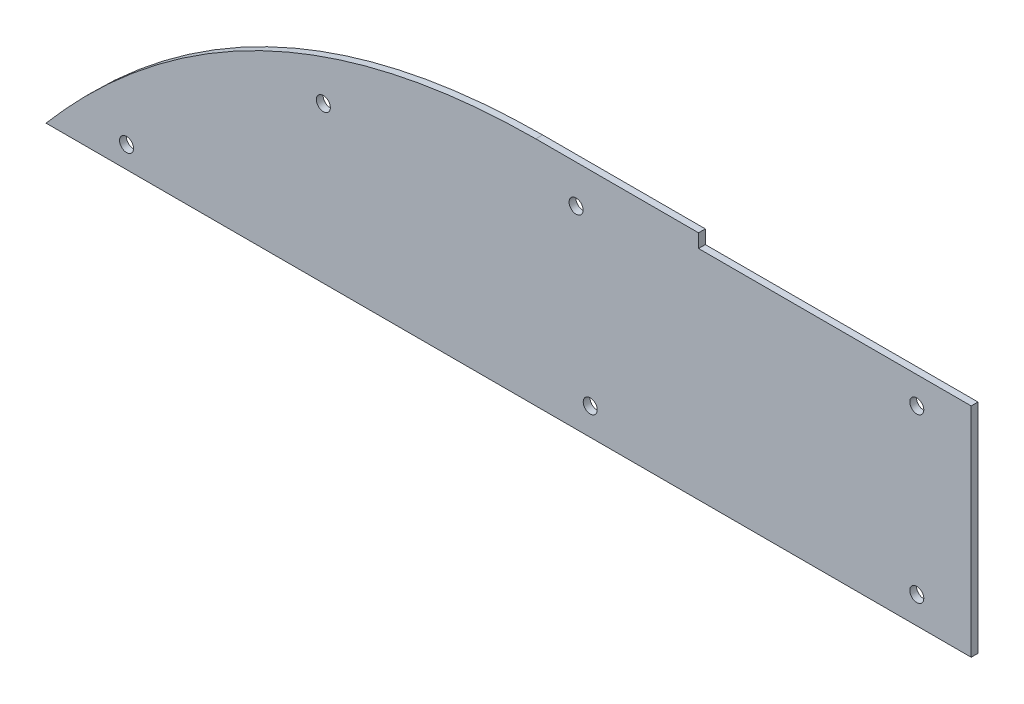
ISO-10303-21;
HEADER;
FILE_DESCRIPTION(('STEP AP214'),'2;1');
FILE_NAME('part.step','',(''),(''),'','','');
FILE_SCHEMA(('AUTOMOTIVE_DESIGN { 1 0 10303 214 1 1 1 1 }'));
ENDSEC;
DATA;
#1=APPLICATION_CONTEXT('core data for automotive mechanical design processes');
#2=APPLICATION_PROTOCOL_DEFINITION('international standard','automotive_design',2000,#1);
#3=PRODUCT_CONTEXT('',#1,'mechanical');
#4=PRODUCT('Part','Part','',(#3));
#5=PRODUCT_RELATED_PRODUCT_CATEGORY('part','',(#4));
#6=PRODUCT_DEFINITION_FORMATION('','',#4);
#7=PRODUCT_DEFINITION_CONTEXT('part definition',#1,'design');
#8=PRODUCT_DEFINITION('design','',#6,#7);
#9=PRODUCT_DEFINITION_SHAPE('','',#8);
#10=(LENGTH_UNIT() NAMED_UNIT(*) SI_UNIT(.MILLI.,.METRE.));
#11=(NAMED_UNIT(*) PLANE_ANGLE_UNIT() SI_UNIT($,.RADIAN.));
#12=(NAMED_UNIT(*) SI_UNIT($,.STERADIAN.) SOLID_ANGLE_UNIT());
#13=UNCERTAINTY_MEASURE_WITH_UNIT(LENGTH_MEASURE(1.E-05),#10,'distance_accuracy_value','');
#14=(GEOMETRIC_REPRESENTATION_CONTEXT(3) GLOBAL_UNCERTAINTY_ASSIGNED_CONTEXT((#13)) GLOBAL_UNIT_ASSIGNED_CONTEXT((#10,
#11,#12)) REPRESENTATION_CONTEXT('',''));
#15=CARTESIAN_POINT('',(0.,0.,0.));
#16=DIRECTION('',(0.,0.,1.));
#17=DIRECTION('',(1.,0.,0.));
#18=AXIS2_PLACEMENT_3D('',#15,#16,#17);
#19=CARTESIAN_POINT('',(127.,0.,0.));
#20=DIRECTION('',(1.,0.,0.));
#21=DIRECTION('',(0.,0.,-1.));
#22=AXIS2_PLACEMENT_3D('',#19,#20,#21);
#23=PLANE('',#22);
#24=DIRECTION('',(0.,1.,0.));
#25=VECTOR('',#24,1.);
#26=CARTESIAN_POINT('',(127.,76.2,3.175));
#27=LINE('',#26,#25);
#28=CARTESIAN_POINT('',(127.,0.,3.175));
#29=VERTEX_POINT('',#28);
#30=CARTESIAN_POINT('',(127.,101.6,3.175));
#31=VERTEX_POINT('',#30);
#32=EDGE_CURVE('E110',#29,#31,#27,.T.);
#33=ORIENTED_EDGE('',*,*,#32,.F.);
#34=DIRECTION('',(0.,0.,-1.));
#35=VECTOR('',#34,1.);
#36=CARTESIAN_POINT('',(127.,0.,3.175));
#37=LINE('',#36,#35);
#38=CARTESIAN_POINT('',(127.,0.,0.));
#39=VERTEX_POINT('',#38);
#40=EDGE_CURVE('E116',#29,#39,#37,.T.);
#41=ORIENTED_EDGE('',*,*,#40,.T.);
#42=DIRECTION('',(0.,-1.,0.));
#43=VECTOR('',#42,1.);
#44=CARTESIAN_POINT('',(127.,80.6674906682584,0.));
#45=LINE('',#44,#43);
#46=CARTESIAN_POINT('',(127.,101.6,0.));
#47=VERTEX_POINT('',#46);
#48=EDGE_CURVE('E49',#47,#39,#45,.T.);
#49=ORIENTED_EDGE('',*,*,#48,.F.);
#50=DIRECTION('',(0.,0.,1.));
#51=VECTOR('',#50,1.);
#52=CARTESIAN_POINT('',(127.,101.6,0.));
#53=LINE('',#52,#51);
#54=EDGE_CURVE('E102',#47,#31,#53,.T.);
#55=ORIENTED_EDGE('',*,*,#54,.T.);
#56=EDGE_LOOP('',(#33,#41,#49,#55));
#57=FACE_BOUND('',#56,.T.);
#58=ADVANCED_FACE('F45',(#57),#23,.T.);
#59=CARTESIAN_POINT('',(-1.929,76.2,3.175));
#60=DIRECTION('',(0.,0.,1.));
#61=DIRECTION('',(1.,0.,0.));
#62=AXIS2_PLACEMENT_3D('',#59,#60,#61);
#63=PLANE('',#62);
#64=CARTESIAN_POINT('',(101.6,88.9,3.175));
#65=DIRECTION('',(0.,0.,-1.));
#66=DIRECTION('',(-1.,0.,0.));
#67=AXIS2_PLACEMENT_3D('',#64,#65,#66);
#68=CIRCLE('',#67,3.27500000000001);
#69=CARTESIAN_POINT('',(98.325,88.9,3.175));
#70=VERTEX_POINT('',#69);
#71=EDGE_CURVE('E159',#70,#70,#68,.T.);
#72=ORIENTED_EDGE('',*,*,#71,.T.);
#73=EDGE_LOOP('',(#72));
#74=FACE_BOUND('',#73,.T.);
#75=CARTESIAN_POINT('',(101.6,12.7,3.175));
#76=DIRECTION('',(0.,0.,-1.));
#77=DIRECTION('',(-1.,0.,0.));
#78=AXIS2_PLACEMENT_3D('',#75,#76,#77);
#79=CIRCLE('',#78,3.27500000000001);
#80=CARTESIAN_POINT('',(98.325,12.7,3.175));
#81=VERTEX_POINT('',#80);
#82=EDGE_CURVE('E156',#81,#81,#79,.T.);
#83=ORIENTED_EDGE('',*,*,#82,.T.);
#84=EDGE_LOOP('',(#83));
#85=FACE_BOUND('',#84,.T.);
#86=CARTESIAN_POINT('',(-50.8,12.7,3.175));
#87=DIRECTION('',(0.,0.,-1.));
#88=DIRECTION('',(-1.,0.,0.));
#89=AXIS2_PLACEMENT_3D('',#86,#87,#88);
#90=CIRCLE('',#89,3.27500000000001);
#91=CARTESIAN_POINT('',(-54.075,12.7,3.175));
#92=VERTEX_POINT('',#91);
#93=EDGE_CURVE('E149',#92,#92,#90,.T.);
#94=ORIENTED_EDGE('',*,*,#93,.T.);
#95=EDGE_LOOP('',(#94));
#96=FACE_BOUND('',#95,.T.);
#97=CARTESIAN_POINT('',(-175.365808452393,72.6222695788124,3.175));
#98=DIRECTION('',(0.,0.,1.));
#99=DIRECTION('',(1.,0.,0.));
#100=AXIS2_PLACEMENT_3D('',#97,#98,#99);
#101=CIRCLE('',#100,3.27499999999999);
#102=CARTESIAN_POINT('',(-172.090808452393,72.6222695788124,3.175));
#103=VERTEX_POINT('',#102);
#104=EDGE_CURVE('E177',#103,#103,#101,.F.);
#105=ORIENTED_EDGE('',*,*,#104,.T.);
#106=EDGE_LOOP('',(#105));
#107=FACE_BOUND('',#106,.T.);
#108=CARTESIAN_POINT('',(-267.208000000189,10.1599999999449,3.175));
#109=DIRECTION('',(0.,0.,1.));
#110=DIRECTION('',(1.,0.,0.));
#111=AXIS2_PLACEMENT_3D('',#108,#109,#110);
#112=CIRCLE('',#111,3.27499999999996);
#113=CARTESIAN_POINT('',(-263.933000000189,10.1599999999449,3.175));
#114=VERTEX_POINT('',#113);
#115=EDGE_CURVE('E54',#114,#114,#112,.F.);
#116=ORIENTED_EDGE('',*,*,#115,.T.);
#117=EDGE_LOOP('',(#116));
#118=FACE_BOUND('',#117,.T.);
#119=CARTESIAN_POINT('',(-57.404,90.1701915203067,3.175));
#120=DIRECTION('',(0.,0.,1.));
#121=DIRECTION('',(1.,0.,0.));
#122=AXIS2_PLACEMENT_3D('',#119,#120,#121);
#123=CIRCLE('',#122,3.27500000000001);
#124=CARTESIAN_POINT('',(-54.129,90.1701915203067,3.175));
#125=VERTEX_POINT('',#124);
#126=EDGE_CURVE('E174',#125,#125,#123,.F.);
#127=ORIENTED_EDGE('',*,*,#126,.T.);
#128=EDGE_LOOP('',(#127));
#129=FACE_BOUND('',#128,.T.);
#130=DIRECTION('',(1.,0.,0.));
#131=VECTOR('',#130,1.);
#132=CARTESIAN_POINT('',(0.,0.,3.175));
#133=LINE('',#132,#131);
#134=CARTESIAN_POINT('',(-304.8,0.,3.175));
#135=VERTEX_POINT('',#134);
#136=EDGE_CURVE('E112',#135,#29,#133,.T.);
#137=ORIENTED_EDGE('',*,*,#136,.T.);
#138=ORIENTED_EDGE('',*,*,#32,.T.);
#139=DIRECTION('',(1.,0.,0.));
#140=VECTOR('',#139,1.);
#141=CARTESIAN_POINT('',(609.6,101.6,3.175));
#142=LINE('',#141,#140);
#143=CARTESIAN_POINT('',(-0.254,101.6,3.175));
#144=VERTEX_POINT('',#143);
#145=EDGE_CURVE('E62',#144,#31,#142,.T.);
#146=ORIENTED_EDGE('',*,*,#145,.F.);
#147=DIRECTION('',(0.,1.,0.));
#148=VECTOR('',#147,1.);
#149=CARTESIAN_POINT('',(-0.254,107.95,3.175));
#150=LINE('',#149,#148);
#151=CARTESIAN_POINT('',(-0.254,107.95,3.175));
#152=VERTEX_POINT('',#151);
#153=EDGE_CURVE('E172',#144,#152,#150,.T.);
#154=ORIENTED_EDGE('',*,*,#153,.T.);
#155=DIRECTION('',(-1.,0.,0.));
#156=VECTOR('',#155,1.);
#157=CARTESIAN_POINT('',(0.,107.95,3.175));
#158=LINE('',#157,#156);
#159=CARTESIAN_POINT('',(-76.2,107.95,3.175));
#160=VERTEX_POINT('',#159);
#161=EDGE_CURVE('E133',#152,#160,#158,.T.);
#162=ORIENTED_EDGE('',*,*,#161,.T.);
#163=CARTESIAN_POINT('',(-76.2,107.95,3.175));
#164=CARTESIAN_POINT('',(-213.403997346706,107.359981336517,3.175));
#165=CARTESIAN_POINT('',(-304.8,0.,3.175));
#166=B_SPLINE_CURVE_WITH_KNOTS('',2,(#163,#164,#165),.UNSPECIFIED.,.F.,.F.,(3,3),(0.,1.),.UNSPECIFIED.);
#167=EDGE_CURVE('E11',#160,#135,#166,.T.);
#168=ORIENTED_EDGE('',*,*,#167,.T.);
#169=EDGE_LOOP('',(#137,#138,#146,#154,#162,#168));
#170=FACE_BOUND('',#169,.T.);
#171=ADVANCED_FACE('F111',(#74,#85,#96,#107,#118,#129,#170),#63,.T.);
#172=CARTESIAN_POINT('',(0.,0.,3.175));
#173=DIRECTION('',(0.,1.,0.));
#174=DIRECTION('',(-1.,0.,0.));
#175=AXIS2_PLACEMENT_3D('',#172,#173,#174);
#176=PLANE('',#175);
#177=ORIENTED_EDGE('',*,*,#40,.F.);
#178=ORIENTED_EDGE('',*,*,#136,.F.);
#179=DIRECTION('',(0.,0.,-1.));
#180=VECTOR('',#179,1.);
#181=CARTESIAN_POINT('',(-304.8,0.,3.175));
#182=LINE('',#181,#180);
#183=CARTESIAN_POINT('',(-304.8,0.,0.));
#184=VERTEX_POINT('',#183);
#185=EDGE_CURVE('E129',#135,#184,#182,.T.);
#186=ORIENTED_EDGE('',*,*,#185,.T.);
#187=DIRECTION('',(1.,0.,0.));
#188=VECTOR('',#187,1.);
#189=CARTESIAN_POINT('',(0.,0.,0.));
#190=LINE('',#189,#188);
#191=EDGE_CURVE('E124',#184,#39,#190,.T.);
#192=ORIENTED_EDGE('',*,*,#191,.T.);
#193=EDGE_LOOP('',(#177,#178,#186,#192));
#194=FACE_BOUND('',#193,.T.);
#195=ADVANCED_FACE('F204',(#194),#176,.F.);
#196=CARTESIAN_POINT('',(811.551998673353,80.6674906682584,0.));
#197=DIRECTION('',(0.,0.,-1.));
#198=DIRECTION('',(-1.,0.,0.));
#199=AXIS2_PLACEMENT_3D('',#196,#197,#198);
#200=PLANE('',#199);
#201=CARTESIAN_POINT('',(-57.404,90.1701915203067,0.));
#202=DIRECTION('',(0.,0.,1.));
#203=DIRECTION('',(1.,0.,0.));
#204=AXIS2_PLACEMENT_3D('',#201,#202,#203);
#205=CIRCLE('',#204,3.27500000000001);
#206=CARTESIAN_POINT('',(-54.129,90.1701915203067,0.));
#207=VERTEX_POINT('',#206);
#208=EDGE_CURVE('E145',#207,#207,#205,.T.);
#209=ORIENTED_EDGE('',*,*,#208,.T.);
#210=EDGE_LOOP('',(#209));
#211=FACE_BOUND('',#210,.T.);
#212=CARTESIAN_POINT('',(-175.365808452393,72.6222695788124,0.));
#213=DIRECTION('',(0.,0.,1.));
#214=DIRECTION('',(1.,0.,0.));
#215=AXIS2_PLACEMENT_3D('',#212,#213,#214);
#216=CIRCLE('',#215,3.27499999999999);
#217=CARTESIAN_POINT('',(-172.090808452393,72.6222695788124,0.));
#218=VERTEX_POINT('',#217);
#219=EDGE_CURVE('E148',#218,#218,#216,.T.);
#220=ORIENTED_EDGE('',*,*,#219,.T.);
#221=EDGE_LOOP('',(#220));
#222=FACE_BOUND('',#221,.T.);
#223=CARTESIAN_POINT('',(-267.208000000189,10.1599999999449,0.));
#224=DIRECTION('',(0.,0.,1.));
#225=DIRECTION('',(1.,0.,0.));
#226=AXIS2_PLACEMENT_3D('',#223,#224,#225);
#227=CIRCLE('',#226,3.27499999999996);
#228=CARTESIAN_POINT('',(-263.933000000189,10.1599999999449,0.));
#229=VERTEX_POINT('',#228);
#230=EDGE_CURVE('E107',#229,#229,#227,.T.);
#231=ORIENTED_EDGE('',*,*,#230,.T.);
#232=EDGE_LOOP('',(#231));
#233=FACE_BOUND('',#232,.T.);
#234=CARTESIAN_POINT('',(101.6,88.9,0.));
#235=DIRECTION('',(0.,0.,-1.));
#236=DIRECTION('',(-1.,0.,0.));
#237=AXIS2_PLACEMENT_3D('',#234,#235,#236);
#238=CIRCLE('',#237,3.27500000000001);
#239=CARTESIAN_POINT('',(98.325,88.9,0.));
#240=VERTEX_POINT('',#239);
#241=EDGE_CURVE('E163',#240,#240,#238,.T.);
#242=ORIENTED_EDGE('',*,*,#241,.F.);
#243=EDGE_LOOP('',(#242));
#244=FACE_BOUND('',#243,.T.);
#245=CARTESIAN_POINT('',(101.6,12.7,0.));
#246=DIRECTION('',(0.,0.,-1.));
#247=DIRECTION('',(-1.,0.,0.));
#248=AXIS2_PLACEMENT_3D('',#245,#246,#247);
#249=CIRCLE('',#248,3.27500000000001);
#250=CARTESIAN_POINT('',(98.325,12.7,0.));
#251=VERTEX_POINT('',#250);
#252=EDGE_CURVE('E166',#251,#251,#249,.T.);
#253=ORIENTED_EDGE('',*,*,#252,.F.);
#254=EDGE_LOOP('',(#253));
#255=FACE_BOUND('',#254,.T.);
#256=CARTESIAN_POINT('',(-50.8,12.7,0.));
#257=DIRECTION('',(0.,0.,-1.));
#258=DIRECTION('',(-1.,0.,0.));
#259=AXIS2_PLACEMENT_3D('',#256,#257,#258);
#260=CIRCLE('',#259,3.27500000000001);
#261=CARTESIAN_POINT('',(-54.075,12.7,0.));
#262=VERTEX_POINT('',#261);
#263=EDGE_CURVE('E162',#262,#262,#260,.T.);
#264=ORIENTED_EDGE('',*,*,#263,.F.);
#265=EDGE_LOOP('',(#264));
#266=FACE_BOUND('',#265,.T.);
#267=DIRECTION('',(1.,0.,0.));
#268=VECTOR('',#267,1.);
#269=CARTESIAN_POINT('',(-0.254,101.6,0.));
#270=LINE('',#269,#268);
#271=CARTESIAN_POINT('',(-0.253999999999976,101.6,0.));
#272=VERTEX_POINT('',#271);
#273=EDGE_CURVE('E121',#272,#47,#270,.T.);
#274=ORIENTED_EDGE('',*,*,#273,.T.);
#275=ORIENTED_EDGE('',*,*,#48,.T.);
#276=ORIENTED_EDGE('',*,*,#191,.F.);
#277=CARTESIAN_POINT('',(-76.2,107.95,0.));
#278=CARTESIAN_POINT('',(-213.403997346706,107.359981336517,0.));
#279=CARTESIAN_POINT('',(-304.8,0.,0.));
#280=B_SPLINE_CURVE_WITH_KNOTS('',2,(#277,#278,#279),.UNSPECIFIED.,.F.,.F.,(3,3),(0.,1.),.UNSPECIFIED.);
#281=CARTESIAN_POINT('',(-76.2,107.95,0.));
#282=VERTEX_POINT('',#281);
#283=EDGE_CURVE('E127',#282,#184,#280,.T.);
#284=ORIENTED_EDGE('',*,*,#283,.F.);
#285=DIRECTION('',(-1.,0.,0.));
#286=VECTOR('',#285,1.);
#287=CARTESIAN_POINT('',(0.,107.95,0.));
#288=LINE('',#287,#286);
#289=CARTESIAN_POINT('',(-0.254,107.95,0.));
#290=VERTEX_POINT('',#289);
#291=EDGE_CURVE('E130',#290,#282,#288,.T.);
#292=ORIENTED_EDGE('',*,*,#291,.F.);
#293=DIRECTION('',(0.,-1.,0.));
#294=VECTOR('',#293,1.);
#295=CARTESIAN_POINT('',(-0.254,107.95,0.));
#296=LINE('',#295,#294);
#297=EDGE_CURVE('E106',#290,#272,#296,.T.);
#298=ORIENTED_EDGE('',*,*,#297,.T.);
#299=EDGE_LOOP('',(#274,#275,#276,#284,#292,#298));
#300=FACE_BOUND('',#299,.T.);
#301=ADVANCED_FACE('F207',(#211,#222,#233,#244,#255,#266,#300),#200,.T.);
#302=CARTESIAN_POINT('',(609.6,101.6,0.));
#303=DIRECTION('',(0.,-1.,0.));
#304=DIRECTION('',(0.,0.,-1.));
#305=AXIS2_PLACEMENT_3D('',#302,#303,#304);
#306=PLANE('',#305);
#307=ORIENTED_EDGE('',*,*,#54,.F.);
#308=ORIENTED_EDGE('',*,*,#273,.F.);
#309=DIRECTION('',(0.,0.,1.));
#310=VECTOR('',#309,1.);
#311=CARTESIAN_POINT('',(-0.254,101.6,0.));
#312=LINE('',#311,#310);
#313=EDGE_CURVE('E104',#272,#144,#312,.T.);
#314=ORIENTED_EDGE('',*,*,#313,.T.);
#315=ORIENTED_EDGE('',*,*,#145,.T.);
#316=EDGE_LOOP('',(#307,#308,#314,#315));
#317=FACE_BOUND('',#316,.T.);
#318=ADVANCED_FACE('F47',(#317),#306,.F.);
#319=CARTESIAN_POINT('',(0.,107.95,3.175));
#320=DIRECTION('',(0.,-1.,0.));
#321=DIRECTION('',(1.,0.,0.));
#322=AXIS2_PLACEMENT_3D('',#319,#320,#321);
#323=PLANE('',#322);
#324=ORIENTED_EDGE('',*,*,#161,.F.);
#325=DIRECTION('',(0.,0.,1.));
#326=VECTOR('',#325,1.);
#327=CARTESIAN_POINT('',(-0.254,107.95,0.));
#328=LINE('',#327,#326);
#329=EDGE_CURVE('E123',#290,#152,#328,.T.);
#330=ORIENTED_EDGE('',*,*,#329,.F.);
#331=ORIENTED_EDGE('',*,*,#291,.T.);
#332=DIRECTION('',(0.,0.,-1.));
#333=VECTOR('',#332,1.);
#334=CARTESIAN_POINT('',(-76.2,107.95,3.175));
#335=LINE('',#334,#333);
#336=EDGE_CURVE('E70',#160,#282,#335,.T.);
#337=ORIENTED_EDGE('',*,*,#336,.F.);
#338=EDGE_LOOP('',(#324,#330,#331,#337));
#339=FACE_BOUND('',#338,.T.);
#340=ADVANCED_FACE('F198',(#339),#323,.F.);
#341=CARTESIAN_POINT('',(-50.8,12.7,12.7));
#342=DIRECTION('',(0.,0.,-1.));
#343=DIRECTION('',(-1.,0.,0.));
#344=AXIS2_PLACEMENT_3D('',#341,#342,#343);
#345=CYLINDRICAL_SURFACE('',#344,3.27500000000001);
#346=ORIENTED_EDGE('',*,*,#263,.T.);
#347=EDGE_LOOP('',(#346));
#348=FACE_BOUND('',#347,.T.);
#349=ORIENTED_EDGE('',*,*,#93,.F.);
#350=EDGE_LOOP('',(#349));
#351=FACE_BOUND('',#350,.T.);
#352=ADVANCED_FACE('F201',(#348,#351),#345,.F.);
#353=CARTESIAN_POINT('',(101.6,12.7,12.7));
#354=DIRECTION('',(0.,0.,-1.));
#355=DIRECTION('',(-1.,0.,0.));
#356=AXIS2_PLACEMENT_3D('',#353,#354,#355);
#357=CYLINDRICAL_SURFACE('',#356,3.27500000000001);
#358=ORIENTED_EDGE('',*,*,#252,.T.);
#359=EDGE_LOOP('',(#358));
#360=FACE_BOUND('',#359,.T.);
#361=ORIENTED_EDGE('',*,*,#82,.F.);
#362=EDGE_LOOP('',(#361));
#363=FACE_BOUND('',#362,.T.);
#364=ADVANCED_FACE('F243',(#360,#363),#357,.F.);
#365=CARTESIAN_POINT('',(101.6,88.9,12.7));
#366=DIRECTION('',(0.,0.,-1.));
#367=DIRECTION('',(-1.,0.,0.));
#368=AXIS2_PLACEMENT_3D('',#365,#366,#367);
#369=CYLINDRICAL_SURFACE('',#368,3.27500000000001);
#370=ORIENTED_EDGE('',*,*,#241,.T.);
#371=EDGE_LOOP('',(#370));
#372=FACE_BOUND('',#371,.T.);
#373=ORIENTED_EDGE('',*,*,#71,.F.);
#374=EDGE_LOOP('',(#373));
#375=FACE_BOUND('',#374,.T.);
#376=ADVANCED_FACE('F196',(#372,#375),#369,.F.);
#377=CARTESIAN_POINT('',(-267.208000000189,10.1599999999449,0.));
#378=DIRECTION('',(0.,0.,1.));
#379=DIRECTION('',(1.,0.,0.));
#380=AXIS2_PLACEMENT_3D('',#377,#378,#379);
#381=CYLINDRICAL_SURFACE('',#380,3.27499999999996);
#382=ORIENTED_EDGE('',*,*,#230,.F.);
#383=EDGE_LOOP('',(#382));
#384=FACE_BOUND('',#383,.T.);
#385=ORIENTED_EDGE('',*,*,#115,.F.);
#386=EDGE_LOOP('',(#385));
#387=FACE_BOUND('',#386,.T.);
#388=ADVANCED_FACE('F250',(#384,#387),#381,.F.);
#389=CARTESIAN_POINT('',(-175.365808452393,72.6222695788124,0.));
#390=DIRECTION('',(0.,0.,1.));
#391=DIRECTION('',(1.,0.,0.));
#392=AXIS2_PLACEMENT_3D('',#389,#390,#391);
#393=CYLINDRICAL_SURFACE('',#392,3.27499999999999);
#394=ORIENTED_EDGE('',*,*,#219,.F.);
#395=EDGE_LOOP('',(#394));
#396=FACE_BOUND('',#395,.T.);
#397=ORIENTED_EDGE('',*,*,#104,.F.);
#398=EDGE_LOOP('',(#397));
#399=FACE_BOUND('',#398,.T.);
#400=ADVANCED_FACE('F265',(#396,#399),#393,.F.);
#401=CARTESIAN_POINT('',(-57.404,90.1701915203067,0.));
#402=DIRECTION('',(0.,0.,1.));
#403=DIRECTION('',(1.,0.,0.));
#404=AXIS2_PLACEMENT_3D('',#401,#402,#403);
#405=CYLINDRICAL_SURFACE('',#404,3.27500000000001);
#406=ORIENTED_EDGE('',*,*,#208,.F.);
#407=EDGE_LOOP('',(#406));
#408=FACE_BOUND('',#407,.T.);
#409=ORIENTED_EDGE('',*,*,#126,.F.);
#410=EDGE_LOOP('',(#409));
#411=FACE_BOUND('',#410,.T.);
#412=ADVANCED_FACE('F194',(#408,#411),#405,.F.);
#413=DIRECTION('',(0.,0.,-1.));
#414=VECTOR('',#413,1.);
#415=SURFACE_OF_LINEAR_EXTRUSION('',#166,#414);
#416=ORIENTED_EDGE('',*,*,#283,.T.);
#417=ORIENTED_EDGE('',*,*,#185,.F.);
#418=ORIENTED_EDGE('',*,*,#167,.F.);
#419=ORIENTED_EDGE('',*,*,#336,.T.);
#420=EDGE_LOOP('',(#416,#417,#418,#419));
#421=FACE_BOUND('',#420,.T.);
#422=ADVANCED_FACE('F189',(#421),#415,.F.);
#423=CARTESIAN_POINT('',(-0.254,107.95,0.));
#424=DIRECTION('',(-1.,0.,0.));
#425=DIRECTION('',(0.,0.,1.));
#426=AXIS2_PLACEMENT_3D('',#423,#424,#425);
#427=PLANE('',#426);
#428=ORIENTED_EDGE('',*,*,#153,.F.);
#429=ORIENTED_EDGE('',*,*,#313,.F.);
#430=ORIENTED_EDGE('',*,*,#297,.F.);
#431=ORIENTED_EDGE('',*,*,#329,.T.);
#432=EDGE_LOOP('',(#428,#429,#430,#431));
#433=FACE_BOUND('',#432,.T.);
#434=ADVANCED_FACE('F193',(#433),#427,.F.);
#435=CLOSED_SHELL('',(#58,#171,#195,#301,#318,#340,#352,#364,#376,#388,#400,#412,#422,#434));
#436=MANIFOLD_SOLID_BREP('B2',#435);
#437=ADVANCED_BREP_SHAPE_REPRESENTATION('',(#18,#436),#14);
#438=SHAPE_DEFINITION_REPRESENTATION(#9,#437);
ENDSEC;
END-ISO-10303-21;
